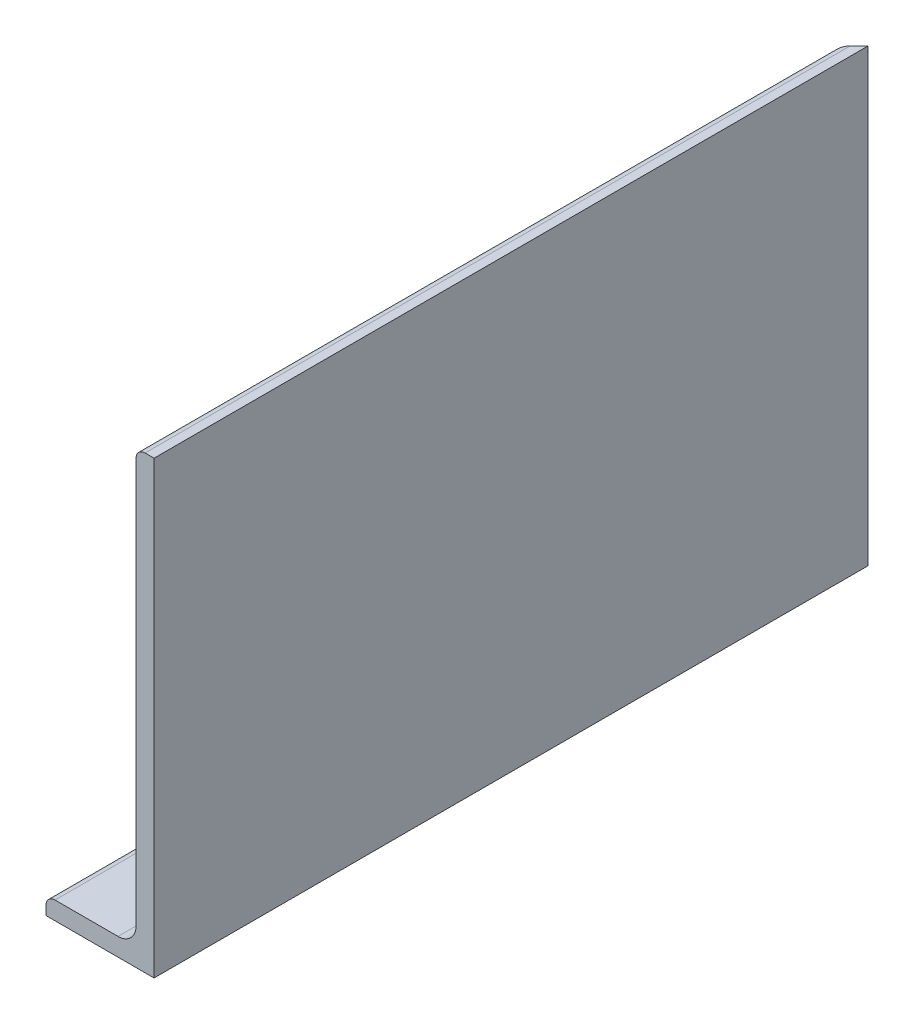
ISO-10303-21;
HEADER;
FILE_DESCRIPTION(('STEP AP214'),'2;1');
FILE_NAME('part.step','',(''),(''),'','','');
FILE_SCHEMA(('AUTOMOTIVE_DESIGN { 1 0 10303 214 1 1 1 1 }'));
ENDSEC;
DATA;
#1=APPLICATION_CONTEXT('core data for automotive mechanical design processes');
#2=APPLICATION_PROTOCOL_DEFINITION('international standard','automotive_design',2000,#1);
#3=PRODUCT_CONTEXT('',#1,'mechanical');
#4=PRODUCT('Part','Part','',(#3));
#5=PRODUCT_RELATED_PRODUCT_CATEGORY('part','',(#4));
#6=PRODUCT_DEFINITION_FORMATION('','',#4);
#7=PRODUCT_DEFINITION_CONTEXT('part definition',#1,'design');
#8=PRODUCT_DEFINITION('design','',#6,#7);
#9=PRODUCT_DEFINITION_SHAPE('','',#8);
#10=(LENGTH_UNIT() NAMED_UNIT(*) SI_UNIT(.MILLI.,.METRE.));
#11=(NAMED_UNIT(*) PLANE_ANGLE_UNIT() SI_UNIT($,.RADIAN.));
#12=(NAMED_UNIT(*) SI_UNIT($,.STERADIAN.) SOLID_ANGLE_UNIT());
#13=UNCERTAINTY_MEASURE_WITH_UNIT(LENGTH_MEASURE(1.E-05),#10,'distance_accuracy_value','');
#14=(GEOMETRIC_REPRESENTATION_CONTEXT(3) GLOBAL_UNCERTAINTY_ASSIGNED_CONTEXT((#13)) GLOBAL_UNIT_ASSIGNED_CONTEXT((#10,
#11,#12)) REPRESENTATION_CONTEXT('',''));
#15=CARTESIAN_POINT('',(0.,0.,0.));
#16=DIRECTION('',(0.,0.,1.));
#17=DIRECTION('',(1.,0.,0.));
#18=AXIS2_PLACEMENT_3D('',#15,#16,#17);
#19=CARTESIAN_POINT('',(291.529130064764,-14.2713678069181,79.29));
#20=DIRECTION('',(0.,-1.,0.));
#21=DIRECTION('',(0.,0.,-1.));
#22=AXIS2_PLACEMENT_3D('',#19,#20,#21);
#23=PLANE('',#22);
#24=DIRECTION('',(0.,0.,-1.));
#25=VECTOR('',#24,1.);
#26=CARTESIAN_POINT('',(293.529130064764,-14.2713678069181,79.29));
#27=LINE('',#26,#25);
#28=CARTESIAN_POINT('',(293.529130064764,-14.2713678069181,79.29));
#29=VERTEX_POINT('',#28);
#30=CARTESIAN_POINT('',(293.529130064764,-14.2713678069181,0.));
#31=VERTEX_POINT('',#30);
#32=EDGE_CURVE('E120',#29,#31,#27,.T.);
#33=ORIENTED_EDGE('',*,*,#32,.T.);
#34=DIRECTION('',(0.707106781186542,0.,-0.707106781186553));
#35=VECTOR('',#34,1.);
#36=CARTESIAN_POINT('',(293.529130064764,-14.2713678069181,0.));
#37=LINE('',#36,#35);
#38=CARTESIAN_POINT('',(292.529130064764,-14.2713678069181,1.00000000000002));
#39=VERTEX_POINT('',#38);
#40=EDGE_CURVE('E103',#39,#31,#37,.T.);
#41=ORIENTED_EDGE('',*,*,#40,.F.);
#42=DIRECTION('',(0.,0.,-1.));
#43=VECTOR('',#42,1.);
#44=CARTESIAN_POINT('',(292.529130064764,-14.2713678069181,79.29));
#45=LINE('',#44,#43);
#46=CARTESIAN_POINT('',(292.529130064764,-14.2713678069181,79.29));
#47=VERTEX_POINT('',#46);
#48=EDGE_CURVE('E149',#39,#47,#45,.F.);
#49=ORIENTED_EDGE('',*,*,#48,.T.);
#50=DIRECTION('',(-1.,0.,0.));
#51=VECTOR('',#50,1.);
#52=CARTESIAN_POINT('',(291.529130064764,-14.2713678069181,79.29));
#53=LINE('',#52,#51);
#54=EDGE_CURVE('E124',#29,#47,#53,.T.);
#55=ORIENTED_EDGE('',*,*,#54,.F.);
#56=EDGE_LOOP('',(#33,#41,#49,#55));
#57=FACE_BOUND('',#56,.T.);
#58=ADVANCED_FACE('F33',(#57),#23,.F.);
#59=CARTESIAN_POINT('',(291.529130064764,-62.2713678069181,79.29));
#60=DIRECTION('',(1.,0.,0.));
#61=DIRECTION('',(0.,0.,-1.));
#62=AXIS2_PLACEMENT_3D('',#59,#60,#61);
#63=PLANE('',#62);
#64=DIRECTION('',(0.,0.,-1.));
#65=VECTOR('',#64,1.);
#66=CARTESIAN_POINT('',(291.529130064764,-15.2713678069181,79.29));
#67=LINE('',#66,#65);
#68=CARTESIAN_POINT('',(291.529130064764,-15.2713678069181,79.29));
#69=VERTEX_POINT('',#68);
#70=CARTESIAN_POINT('',(291.529130064764,-15.2713678069181,2.00000000000003));
#71=VERTEX_POINT('',#70);
#72=EDGE_CURVE('E146',#69,#71,#67,.T.);
#73=ORIENTED_EDGE('',*,*,#72,.T.);
#74=DIRECTION('',(0.,-1.,0.));
#75=VECTOR('',#74,1.);
#76=CARTESIAN_POINT('',(291.529130064764,-62.2713678069181,2.00000000000003));
#77=LINE('',#76,#75);
#78=CARTESIAN_POINT('',(291.529130064764,-60.2713678069181,2.00000000000003));
#79=VERTEX_POINT('',#78);
#80=EDGE_CURVE('E169',#71,#79,#77,.T.);
#81=ORIENTED_EDGE('',*,*,#80,.T.);
#82=DIRECTION('',(0.,0.,-1.));
#83=VECTOR('',#82,1.);
#84=CARTESIAN_POINT('',(291.529130064764,-60.2713678069181,79.29));
#85=LINE('',#84,#83);
#86=CARTESIAN_POINT('',(291.529130064764,-60.2713678069181,79.29));
#87=VERTEX_POINT('',#86);
#88=EDGE_CURVE('E55',#79,#87,#85,.F.);
#89=ORIENTED_EDGE('',*,*,#88,.T.);
#90=DIRECTION('',(0.,-1.,0.));
#91=VECTOR('',#90,1.);
#92=CARTESIAN_POINT('',(291.529130064764,-62.2713678069181,79.29));
#93=LINE('',#92,#91);
#94=EDGE_CURVE('E161',#69,#87,#93,.T.);
#95=ORIENTED_EDGE('',*,*,#94,.F.);
#96=EDGE_LOOP('',(#73,#81,#89,#95));
#97=FACE_BOUND('',#96,.T.);
#98=ADVANCED_FACE('F170',(#97),#63,.F.);
#99=CARTESIAN_POINT('',(281.529130064764,-62.2713678069181,79.29));
#100=DIRECTION('',(0.,-1.,0.));
#101=DIRECTION('',(0.,0.,-1.));
#102=AXIS2_PLACEMENT_3D('',#99,#100,#101);
#103=PLANE('',#102);
#104=CARTESIAN_POINT('',(286.029130064764,-62.2713678069181,20.));
#105=DIRECTION('',(0.,1.,0.));
#106=DIRECTION('',(0.,0.,1.));
#107=AXIS2_PLACEMENT_3D('',#104,#105,#106);
#108=CIRCLE('',#107,1.59999999999996);
#109=CARTESIAN_POINT('',(286.029130064764,-62.2713678069181,21.6));
#110=VERTEX_POINT('',#109);
#111=EDGE_CURVE('E185',#110,#110,#108,.T.);
#112=ORIENTED_EDGE('',*,*,#111,.F.);
#113=EDGE_LOOP('',(#112));
#114=FACE_BOUND('',#113,.T.);
#115=CARTESIAN_POINT('',(286.029130064764,-62.2713678069181,59.29));
#116=DIRECTION('',(0.,1.,0.));
#117=DIRECTION('',(0.,0.,1.));
#118=AXIS2_PLACEMENT_3D('',#115,#116,#117);
#119=CIRCLE('',#118,1.59999999999996);
#120=CARTESIAN_POINT('',(286.029130064764,-62.2713678069181,60.89));
#121=VERTEX_POINT('',#120);
#122=EDGE_CURVE('E182',#121,#121,#119,.T.);
#123=ORIENTED_EDGE('',*,*,#122,.F.);
#124=EDGE_LOOP('',(#123));
#125=FACE_BOUND('',#124,.T.);
#126=DIRECTION('',(0.,0.,-1.));
#127=VECTOR('',#126,1.);
#128=CARTESIAN_POINT('',(289.529130064764,-62.2713678069181,0.));
#129=LINE('',#128,#127);
#130=CARTESIAN_POINT('',(289.529130064764,-62.2713678069181,79.29));
#131=VERTEX_POINT('',#130);
#132=CARTESIAN_POINT('',(289.529130064764,-62.2713678069181,4.00000000000006));
#133=VERTEX_POINT('',#132);
#134=EDGE_CURVE('E151',#131,#133,#129,.T.);
#135=ORIENTED_EDGE('',*,*,#134,.T.);
#136=DIRECTION('',(-0.707106781186542,0.,0.707106781186553));
#137=VECTOR('',#136,1.);
#138=CARTESIAN_POINT('',(247.884130064764,-62.2713678069181,45.6450000000006));
#139=LINE('',#138,#137);
#140=CARTESIAN_POINT('',(282.529130064764,-62.2713678069181,11.0000000000002));
#141=VERTEX_POINT('',#140);
#142=EDGE_CURVE('E48',#133,#141,#139,.T.);
#143=ORIENTED_EDGE('',*,*,#142,.T.);
#144=DIRECTION('',(0.,0.,-1.));
#145=VECTOR('',#144,1.);
#146=CARTESIAN_POINT('',(282.529130064764,-62.2713678069181,79.29));
#147=LINE('',#146,#145);
#148=CARTESIAN_POINT('',(282.529130064764,-62.2713678069181,79.29));
#149=VERTEX_POINT('',#148);
#150=EDGE_CURVE('E140',#141,#149,#147,.F.);
#151=ORIENTED_EDGE('',*,*,#150,.T.);
#152=DIRECTION('',(-1.,0.,0.));
#153=VECTOR('',#152,1.);
#154=CARTESIAN_POINT('',(281.529130064764,-62.2713678069181,79.29));
#155=LINE('',#154,#153);
#156=EDGE_CURVE('E159',#131,#149,#155,.T.);
#157=ORIENTED_EDGE('',*,*,#156,.F.);
#158=EDGE_LOOP('',(#135,#143,#151,#157));
#159=FACE_BOUND('',#158,.T.);
#160=ADVANCED_FACE('F165',(#114,#125,#159),#103,.F.);
#161=CARTESIAN_POINT('',(281.529130064764,-64.2713678069181,79.29));
#162=DIRECTION('',(1.,0.,0.));
#163=DIRECTION('',(0.,0.,-1.));
#164=AXIS2_PLACEMENT_3D('',#161,#162,#163);
#165=PLANE('',#164);
#166=DIRECTION('',(0.,0.,-1.));
#167=VECTOR('',#166,1.);
#168=CARTESIAN_POINT('',(281.529130064764,-63.2713678069181,79.29));
#169=LINE('',#168,#167);
#170=CARTESIAN_POINT('',(281.529130064764,-63.2713678069181,79.29));
#171=VERTEX_POINT('',#170);
#172=CARTESIAN_POINT('',(281.529130064764,-63.2713678069181,12.0000000000002));
#173=VERTEX_POINT('',#172);
#174=EDGE_CURVE('E137',#171,#173,#169,.T.);
#175=ORIENTED_EDGE('',*,*,#174,.T.);
#176=DIRECTION('',(0.,-1.,0.));
#177=VECTOR('',#176,1.);
#178=CARTESIAN_POINT('',(281.529130064764,-64.2713678069181,12.0000000000002));
#179=LINE('',#178,#177);
#180=CARTESIAN_POINT('',(281.529130064764,-64.2713678069181,12.0000000000002));
#181=VERTEX_POINT('',#180);
#182=EDGE_CURVE('E179',#173,#181,#179,.T.);
#183=ORIENTED_EDGE('',*,*,#182,.T.);
#184=DIRECTION('',(0.,0.,-1.));
#185=VECTOR('',#184,1.);
#186=CARTESIAN_POINT('',(281.529130064764,-64.2713678069181,79.29));
#187=LINE('',#186,#185);
#188=CARTESIAN_POINT('',(281.529130064764,-64.2713678069181,79.29));
#189=VERTEX_POINT('',#188);
#190=EDGE_CURVE('E130',#189,#181,#187,.T.);
#191=ORIENTED_EDGE('',*,*,#190,.F.);
#192=DIRECTION('',(0.,-1.,0.));
#193=VECTOR('',#192,1.);
#194=CARTESIAN_POINT('',(281.529130064764,-64.2713678069181,79.29));
#195=LINE('',#194,#193);
#196=EDGE_CURVE('E167',#171,#189,#195,.T.);
#197=ORIENTED_EDGE('',*,*,#196,.F.);
#198=EDGE_LOOP('',(#175,#183,#191,#197));
#199=FACE_BOUND('',#198,.T.);
#200=ADVANCED_FACE('F203',(#199),#165,.F.);
#201=CARTESIAN_POINT('',(293.529130064764,-64.2713678069181,79.29));
#202=DIRECTION('',(0.,1.,0.));
#203=DIRECTION('',(0.,0.,1.));
#204=AXIS2_PLACEMENT_3D('',#201,#202,#203);
#205=PLANE('',#204);
#206=CARTESIAN_POINT('',(286.029130064764,-64.2713678069181,20.));
#207=DIRECTION('',(0.,1.,0.));
#208=DIRECTION('',(0.,0.,1.));
#209=AXIS2_PLACEMENT_3D('',#206,#207,#208);
#210=CIRCLE('',#209,1.59999999999996);
#211=CARTESIAN_POINT('',(286.029130064764,-64.2713678069181,21.6));
#212=VERTEX_POINT('',#211);
#213=EDGE_CURVE('E125',#212,#212,#210,.T.);
#214=ORIENTED_EDGE('',*,*,#213,.T.);
#215=EDGE_LOOP('',(#214));
#216=FACE_BOUND('',#215,.T.);
#217=CARTESIAN_POINT('',(286.029130064764,-64.2713678069181,59.29));
#218=DIRECTION('',(0.,1.,0.));
#219=DIRECTION('',(0.,0.,1.));
#220=AXIS2_PLACEMENT_3D('',#217,#218,#219);
#221=CIRCLE('',#220,1.59999999999996);
#222=CARTESIAN_POINT('',(286.029130064764,-64.2713678069181,60.89));
#223=VERTEX_POINT('',#222);
#224=EDGE_CURVE('E188',#223,#223,#221,.T.);
#225=ORIENTED_EDGE('',*,*,#224,.T.);
#226=EDGE_LOOP('',(#225));
#227=FACE_BOUND('',#226,.T.);
#228=ORIENTED_EDGE('',*,*,#190,.T.);
#229=DIRECTION('',(0.707106781186542,0.,-0.707106781186553));
#230=VECTOR('',#229,1.);
#231=CARTESIAN_POINT('',(293.529130064764,-64.2713678069181,0.));
#232=LINE('',#231,#230);
#233=CARTESIAN_POINT('',(293.529130064764,-64.2713678069181,0.));
#234=VERTEX_POINT('',#233);
#235=EDGE_CURVE('E113',#181,#234,#232,.T.);
#236=ORIENTED_EDGE('',*,*,#235,.T.);
#237=DIRECTION('',(0.,0.,-1.));
#238=VECTOR('',#237,1.);
#239=CARTESIAN_POINT('',(293.529130064764,-64.2713678069181,79.29));
#240=LINE('',#239,#238);
#241=CARTESIAN_POINT('',(293.529130064764,-64.2713678069181,79.29));
#242=VERTEX_POINT('',#241);
#243=EDGE_CURVE('E123',#242,#234,#240,.T.);
#244=ORIENTED_EDGE('',*,*,#243,.F.);
#245=DIRECTION('',(1.,0.,0.));
#246=VECTOR('',#245,1.);
#247=CARTESIAN_POINT('',(293.529130064764,-64.2713678069181,79.29));
#248=LINE('',#247,#246);
#249=EDGE_CURVE('E132',#189,#242,#248,.T.);
#250=ORIENTED_EDGE('',*,*,#249,.F.);
#251=EDGE_LOOP('',(#228,#236,#244,#250));
#252=FACE_BOUND('',#251,.T.);
#253=ADVANCED_FACE('F200',(#216,#227,#252),#205,.F.);
#254=CARTESIAN_POINT('',(293.529130064764,-14.2713678069181,79.29));
#255=DIRECTION('',(-1.,0.,0.));
#256=DIRECTION('',(0.,0.,1.));
#257=AXIS2_PLACEMENT_3D('',#254,#255,#256);
#258=PLANE('',#257);
#259=DIRECTION('',(0.,1.,0.));
#260=VECTOR('',#259,1.);
#261=CARTESIAN_POINT('',(293.529130064764,-14.2713678069181,0.));
#262=LINE('',#261,#260);
#263=EDGE_CURVE('E106',#234,#31,#262,.T.);
#264=ORIENTED_EDGE('',*,*,#263,.T.);
#265=ORIENTED_EDGE('',*,*,#32,.F.);
#266=DIRECTION('',(0.,1.,0.));
#267=VECTOR('',#266,1.);
#268=CARTESIAN_POINT('',(293.529130064764,-14.2713678069181,79.29));
#269=LINE('',#268,#267);
#270=EDGE_CURVE('E128',#242,#29,#269,.T.);
#271=ORIENTED_EDGE('',*,*,#270,.F.);
#272=ORIENTED_EDGE('',*,*,#243,.T.);
#273=EDGE_LOOP('',(#264,#265,#271,#272));
#274=FACE_BOUND('',#273,.T.);
#275=ADVANCED_FACE('F118',(#274),#258,.F.);
#276=CARTESIAN_POINT('',(0.,0.,79.29));
#277=DIRECTION('',(0.,0.,-1.));
#278=DIRECTION('',(-1.,0.,0.));
#279=AXIS2_PLACEMENT_3D('',#276,#277,#278);
#280=PLANE('',#279);
#281=ORIENTED_EDGE('',*,*,#94,.T.);
#282=CARTESIAN_POINT('',(289.529130064764,-60.2713678069181,79.29));
#283=DIRECTION('',(0.,0.,-1.));
#284=DIRECTION('',(-1.,0.,0.));
#285=AXIS2_PLACEMENT_3D('',#282,#283,#284);
#286=CIRCLE('',#285,2.);
#287=EDGE_CURVE('E41',#87,#131,#286,.T.);
#288=ORIENTED_EDGE('',*,*,#287,.T.);
#289=ORIENTED_EDGE('',*,*,#156,.T.);
#290=CARTESIAN_POINT('',(282.529130064764,-63.2713678069181,79.29));
#291=DIRECTION('',(0.,0.,-1.));
#292=DIRECTION('',(-1.,0.,0.));
#293=AXIS2_PLACEMENT_3D('',#290,#291,#292);
#294=CIRCLE('',#293,1.);
#295=EDGE_CURVE('E144',#149,#171,#294,.F.);
#296=ORIENTED_EDGE('',*,*,#295,.T.);
#297=ORIENTED_EDGE('',*,*,#196,.T.);
#298=ORIENTED_EDGE('',*,*,#249,.T.);
#299=ORIENTED_EDGE('',*,*,#270,.T.);
#300=ORIENTED_EDGE('',*,*,#54,.T.);
#301=CARTESIAN_POINT('',(292.529130064764,-15.2713678069181,79.29));
#302=DIRECTION('',(0.,0.,-1.));
#303=DIRECTION('',(-1.,0.,0.));
#304=AXIS2_PLACEMENT_3D('',#301,#302,#303);
#305=CIRCLE('',#304,1.);
#306=EDGE_CURVE('E142',#47,#69,#305,.F.);
#307=ORIENTED_EDGE('',*,*,#306,.T.);
#308=EDGE_LOOP('',(#281,#288,#289,#296,#297,#298,#299,#300,#307));
#309=FACE_BOUND('',#308,.T.);
#310=ADVANCED_FACE('F158',(#309),#280,.F.);
#311=CARTESIAN_POINT('',(282.529130064764,-63.2713678069181,79.29));
#312=DIRECTION('',(0.,0.,-1.));
#313=DIRECTION('',(-1.,0.,0.));
#314=AXIS2_PLACEMENT_3D('',#311,#312,#313);
#315=CYLINDRICAL_SURFACE('',#314,1.);
#316=CARTESIAN_POINT('',(282.529130064764,-63.2713678069181,11.0000000000002));
#317=DIRECTION('',(0.707106781186553,0.,0.707106781186542));
#318=DIRECTION('',(0.707106781186542,0.,-0.707106781186553));
#319=AXIS2_PLACEMENT_3D('',#316,#317,#318);
#320=ELLIPSE('',#319,1.41421356237311,1.);
#321=EDGE_CURVE('E173',#173,#141,#320,.F.);
#322=ORIENTED_EDGE('',*,*,#321,.F.);
#323=ORIENTED_EDGE('',*,*,#174,.F.);
#324=ORIENTED_EDGE('',*,*,#295,.F.);
#325=ORIENTED_EDGE('',*,*,#150,.F.);
#326=EDGE_LOOP('',(#322,#323,#324,#325));
#327=FACE_BOUND('',#326,.T.);
#328=ADVANCED_FACE('F206',(#327),#315,.T.);
#329=CARTESIAN_POINT('',(292.529130064764,-15.2713678069181,79.29));
#330=DIRECTION('',(0.,0.,-1.));
#331=DIRECTION('',(-1.,0.,0.));
#332=AXIS2_PLACEMENT_3D('',#329,#330,#331);
#333=CYLINDRICAL_SURFACE('',#332,1.);
#334=CARTESIAN_POINT('',(292.529130064764,-15.2713678069181,1.00000000000001));
#335=DIRECTION('',(0.707106781186553,0.,0.707106781186542));
#336=DIRECTION('',(0.707106781186542,0.,-0.707106781186553));
#337=AXIS2_PLACEMENT_3D('',#334,#335,#336);
#338=ELLIPSE('',#337,1.41421356237311,1.);
#339=EDGE_CURVE('E109',#71,#39,#338,.F.);
#340=ORIENTED_EDGE('',*,*,#339,.F.);
#341=ORIENTED_EDGE('',*,*,#72,.F.);
#342=ORIENTED_EDGE('',*,*,#306,.F.);
#343=ORIENTED_EDGE('',*,*,#48,.F.);
#344=EDGE_LOOP('',(#340,#341,#342,#343));
#345=FACE_BOUND('',#344,.T.);
#346=ADVANCED_FACE('F208',(#345),#333,.T.);
#347=CARTESIAN_POINT('',(289.529130064764,-60.2713678069181,79.29));
#348=DIRECTION('',(0.,0.,1.));
#349=DIRECTION('',(1.,0.,0.));
#350=AXIS2_PLACEMENT_3D('',#347,#348,#349);
#351=CYLINDRICAL_SURFACE('',#350,2.);
#352=ORIENTED_EDGE('',*,*,#88,.F.);
#353=CARTESIAN_POINT('',(289.529130064764,-60.2713678069181,4.00000000000006));
#354=DIRECTION('',(0.707106781186553,0.,0.707106781186542));
#355=DIRECTION('',(-0.707106781186542,0.,0.707106781186553));
#356=AXIS2_PLACEMENT_3D('',#353,#354,#355);
#357=ELLIPSE('',#356,2.82842712474621,2.);
#358=EDGE_CURVE('E11',#79,#133,#357,.F.);
#359=ORIENTED_EDGE('',*,*,#358,.T.);
#360=ORIENTED_EDGE('',*,*,#134,.F.);
#361=ORIENTED_EDGE('',*,*,#287,.F.);
#362=EDGE_LOOP('',(#352,#359,#360,#361));
#363=FACE_BOUND('',#362,.T.);
#364=ADVANCED_FACE('F35',(#363),#351,.F.);
#365=CARTESIAN_POINT('',(286.029130064764,-64.2713678069181,59.29));
#366=DIRECTION('',(0.,1.,0.));
#367=DIRECTION('',(0.,0.,1.));
#368=AXIS2_PLACEMENT_3D('',#365,#366,#367);
#369=CYLINDRICAL_SURFACE('',#368,1.59999999999996);
#370=ORIENTED_EDGE('',*,*,#224,.F.);
#371=EDGE_LOOP('',(#370));
#372=FACE_BOUND('',#371,.T.);
#373=ORIENTED_EDGE('',*,*,#122,.T.);
#374=EDGE_LOOP('',(#373));
#375=FACE_BOUND('',#374,.T.);
#376=ADVANCED_FACE('F233',(#372,#375),#369,.F.);
#377=CARTESIAN_POINT('',(286.029130064764,-64.2713678069181,20.));
#378=DIRECTION('',(0.,1.,0.));
#379=DIRECTION('',(0.,0.,1.));
#380=AXIS2_PLACEMENT_3D('',#377,#378,#379);
#381=CYLINDRICAL_SURFACE('',#380,1.59999999999996);
#382=ORIENTED_EDGE('',*,*,#213,.F.);
#383=EDGE_LOOP('',(#382));
#384=FACE_BOUND('',#383,.T.);
#385=ORIENTED_EDGE('',*,*,#111,.T.);
#386=EDGE_LOOP('',(#385));
#387=FACE_BOUND('',#386,.T.);
#388=ADVANCED_FACE('F236',(#384,#387),#381,.F.);
#389=CARTESIAN_POINT('',(293.529130064764,-64.2713678069181,0.));
#390=DIRECTION('',(0.707106781186553,0.,0.707106781186542));
#391=DIRECTION('',(0.707106781186542,0.,-0.707106781186553));
#392=AXIS2_PLACEMENT_3D('',#389,#390,#391);
#393=PLANE('',#392);
#394=ORIENTED_EDGE('',*,*,#321,.T.);
#395=ORIENTED_EDGE('',*,*,#142,.F.);
#396=ORIENTED_EDGE('',*,*,#358,.F.);
#397=ORIENTED_EDGE('',*,*,#80,.F.);
#398=ORIENTED_EDGE('',*,*,#339,.T.);
#399=ORIENTED_EDGE('',*,*,#40,.T.);
#400=ORIENTED_EDGE('',*,*,#263,.F.);
#401=ORIENTED_EDGE('',*,*,#235,.F.);
#402=ORIENTED_EDGE('',*,*,#182,.F.);
#403=EDGE_LOOP('',(#394,#395,#396,#397,#398,#399,#400,#401,#402));
#404=FACE_BOUND('',#403,.T.);
#405=ADVANCED_FACE('F105',(#404),#393,.F.);
#406=CLOSED_SHELL('',(#58,#98,#160,#200,#253,#275,#310,#328,#346,#364,#376,#388,#405));
#407=MANIFOLD_SOLID_BREP('B2',#406);
#408=ADVANCED_BREP_SHAPE_REPRESENTATION('',(#18,#407),#14);
#409=SHAPE_DEFINITION_REPRESENTATION(#9,#408);
ENDSEC;
END-ISO-10303-21;
